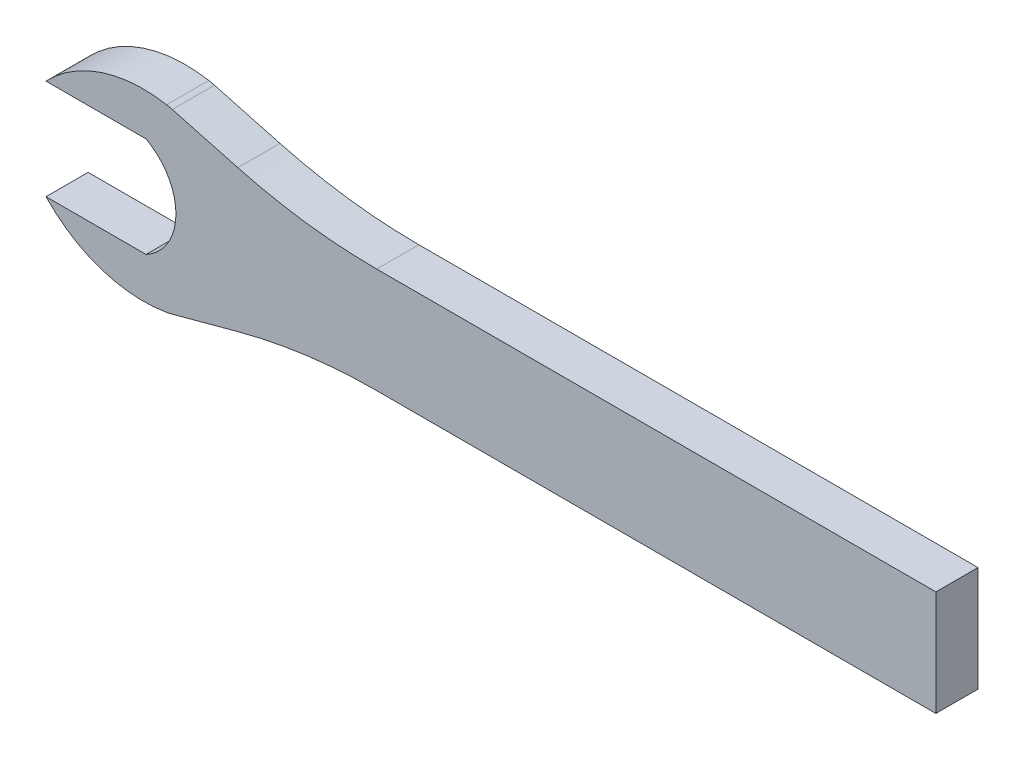
ISO-10303-21;
HEADER;
FILE_DESCRIPTION(('STEP AP214'),'2;1');
FILE_NAME('part.step','',(''),(''),'','','');
FILE_SCHEMA(('AUTOMOTIVE_DESIGN { 1 0 10303 214 1 1 1 1 }'));
ENDSEC;
DATA;
#1=APPLICATION_CONTEXT('core data for automotive mechanical design processes');
#2=APPLICATION_PROTOCOL_DEFINITION('international standard','automotive_design',2000,#1);
#3=PRODUCT_CONTEXT('',#1,'mechanical');
#4=PRODUCT('Part','Part','',(#3));
#5=PRODUCT_RELATED_PRODUCT_CATEGORY('part','',(#4));
#6=PRODUCT_DEFINITION_FORMATION('','',#4);
#7=PRODUCT_DEFINITION_CONTEXT('part definition',#1,'design');
#8=PRODUCT_DEFINITION('design','',#6,#7);
#9=PRODUCT_DEFINITION_SHAPE('','',#8);
#10=(LENGTH_UNIT() NAMED_UNIT(*) SI_UNIT(.MILLI.,.METRE.));
#11=(NAMED_UNIT(*) PLANE_ANGLE_UNIT() SI_UNIT($,.RADIAN.));
#12=(NAMED_UNIT(*) SI_UNIT($,.STERADIAN.) SOLID_ANGLE_UNIT());
#13=UNCERTAINTY_MEASURE_WITH_UNIT(LENGTH_MEASURE(1.E-05),#10,'distance_accuracy_value','');
#14=(GEOMETRIC_REPRESENTATION_CONTEXT(3) GLOBAL_UNCERTAINTY_ASSIGNED_CONTEXT((#13)) GLOBAL_UNIT_ASSIGNED_CONTEXT((#10,
#11,#12)) REPRESENTATION_CONTEXT('',''));
#15=CARTESIAN_POINT('',(0.,0.,0.));
#16=DIRECTION('',(0.,0.,1.));
#17=DIRECTION('',(1.,0.,0.));
#18=AXIS2_PLACEMENT_3D('',#15,#16,#17);
#19=CARTESIAN_POINT('',(1.69056275366741,4.56663578812574,-4.));
#20=DIRECTION('',(0.,0.,1.));
#21=DIRECTION('',(1.,0.,0.));
#22=AXIS2_PLACEMENT_3D('',#19,#20,#21);
#23=CYLINDRICAL_SURFACE('',#22,12.7);
#24=CARTESIAN_POINT('',(1.69056275366741,4.56663578812574,4.));
#25=DIRECTION('',(0.,0.,1.));
#26=DIRECTION('',(1.,0.,0.));
#27=AXIS2_PLACEMENT_3D('',#24,#25,#26);
#28=CIRCLE('',#27,12.7);
#29=CARTESIAN_POINT('',(4.98881020496705,16.8308750123905,4.));
#30=VERTEX_POINT('',#29);
#31=CARTESIAN_POINT('',(3.91240617571897,17.0707715762515,4.));
#32=VERTEX_POINT('',#31);
#33=EDGE_CURVE('E235',#30,#32,#28,.T.);
#34=ORIENTED_EDGE('',*,*,#33,.F.);
#35=DIRECTION('',(0.,0.,1.));
#36=VECTOR('',#35,1.);
#37=CARTESIAN_POINT('',(4.98881020496704,16.8308750123905,-4.));
#38=LINE('',#37,#36);
#39=CARTESIAN_POINT('',(4.98881020496705,16.8308750123905,-4.));
#40=VERTEX_POINT('',#39);
#41=EDGE_CURVE('E67',#40,#30,#38,.T.);
#42=ORIENTED_EDGE('',*,*,#41,.F.);
#43=CARTESIAN_POINT('',(1.69056275366741,4.56663578812574,-4.));
#44=DIRECTION('',(0.,0.,1.));
#45=DIRECTION('',(1.,0.,0.));
#46=AXIS2_PLACEMENT_3D('',#43,#44,#45);
#47=CIRCLE('',#46,12.7);
#48=CARTESIAN_POINT('',(3.91240617571897,17.0707715762515,-4.));
#49=VERTEX_POINT('',#48);
#50=EDGE_CURVE('E218',#40,#49,#47,.T.);
#51=ORIENTED_EDGE('',*,*,#50,.T.);
#52=DIRECTION('',(0.,0.,1.));
#53=VECTOR('',#52,1.);
#54=CARTESIAN_POINT('',(3.91240617571897,17.0707715762515,-4.));
#55=LINE('',#54,#53);
#56=EDGE_CURVE('E248',#49,#32,#55,.T.);
#57=ORIENTED_EDGE('',*,*,#56,.T.);
#58=EDGE_LOOP('',(#34,#42,#51,#57));
#59=FACE_BOUND('',#58,.T.);
#60=ADVANCED_FACE('F42',(#59),#23,.T.);
#61=CARTESIAN_POINT('',(0.,-9.5,-4.));
#62=DIRECTION('',(0.,-1.,0.));
#63=DIRECTION('',(1.,0.,0.));
#64=AXIS2_PLACEMENT_3D('',#61,#62,#63);
#65=PLANE('',#64);
#66=DIRECTION('',(1.,0.,0.));
#67=VECTOR('',#66,1.);
#68=CARTESIAN_POINT('',(0.,-9.5,4.));
#69=LINE('',#68,#67);
#70=CARTESIAN_POINT('',(-19.,-9.5,4.));
#71=VERTEX_POINT('',#70);
#72=CARTESIAN_POINT('',(0.,-9.5,4.));
#73=VERTEX_POINT('',#72);
#74=EDGE_CURVE('E199',#71,#73,#69,.T.);
#75=ORIENTED_EDGE('',*,*,#74,.T.);
#76=DIRECTION('',(0.,0.,1.));
#77=VECTOR('',#76,1.);
#78=CARTESIAN_POINT('',(0.,-9.5,-4.));
#79=LINE('',#78,#77);
#80=CARTESIAN_POINT('',(0.,-9.5,-4.));
#81=VERTEX_POINT('',#80);
#82=EDGE_CURVE('E11',#81,#73,#79,.T.);
#83=ORIENTED_EDGE('',*,*,#82,.F.);
#84=DIRECTION('',(1.,0.,0.));
#85=VECTOR('',#84,1.);
#86=CARTESIAN_POINT('',(0.,-9.5,-4.));
#87=LINE('',#86,#85);
#88=CARTESIAN_POINT('',(-19.,-9.5,-4.));
#89=VERTEX_POINT('',#88);
#90=EDGE_CURVE('E211',#89,#81,#87,.T.);
#91=ORIENTED_EDGE('',*,*,#90,.F.);
#92=DIRECTION('',(0.,0.,1.));
#93=VECTOR('',#92,1.);
#94=CARTESIAN_POINT('',(-19.,-9.5,-4.));
#95=LINE('',#94,#93);
#96=EDGE_CURVE('E46',#89,#71,#95,.T.);
#97=ORIENTED_EDGE('',*,*,#96,.T.);
#98=EDGE_LOOP('',(#75,#83,#91,#97));
#99=FACE_BOUND('',#98,.T.);
#100=ADVANCED_FACE('F44',(#99),#65,.F.);
#101=CARTESIAN_POINT('',(-5.11100762962849,0.,-4.));
#102=DIRECTION('',(0.,0.,1.));
#103=DIRECTION('',(1.,0.,0.));
#104=AXIS2_PLACEMENT_3D('',#101,#102,#103);
#105=CYLINDRICAL_SURFACE('',#104,10.7876039503738);
#106=CARTESIAN_POINT('',(-5.11100762962849,0.,4.));
#107=DIRECTION('',(0.,0.,1.));
#108=DIRECTION('',(1.,0.,0.));
#109=AXIS2_PLACEMENT_3D('',#106,#107,#108);
#110=CIRCLE('',#109,10.7876039503738);
#111=CARTESIAN_POINT('',(0.,9.5,4.));
#112=VERTEX_POINT('',#111);
#113=EDGE_CURVE('E214',#112,#73,#110,.F.);
#114=ORIENTED_EDGE('',*,*,#113,.F.);
#115=DIRECTION('',(0.,0.,1.));
#116=VECTOR('',#115,1.);
#117=CARTESIAN_POINT('',(0.,9.5,-4.));
#118=LINE('',#117,#116);
#119=CARTESIAN_POINT('',(0.,9.5,-4.));
#120=VERTEX_POINT('',#119);
#121=EDGE_CURVE('E51',#120,#112,#118,.T.);
#122=ORIENTED_EDGE('',*,*,#121,.F.);
#123=CARTESIAN_POINT('',(-5.11100762962849,0.,-4.));
#124=DIRECTION('',(0.,0.,1.));
#125=DIRECTION('',(1.,0.,0.));
#126=AXIS2_PLACEMENT_3D('',#123,#124,#125);
#127=CIRCLE('',#126,10.7876039503738);
#128=EDGE_CURVE('E225',#120,#81,#127,.F.);
#129=ORIENTED_EDGE('',*,*,#128,.T.);
#130=ORIENTED_EDGE('',*,*,#82,.T.);
#131=EDGE_LOOP('',(#114,#122,#129,#130));
#132=FACE_BOUND('',#131,.T.);
#133=ADVANCED_FACE('F279',(#132),#105,.F.);
#134=CARTESIAN_POINT('',(0.,9.5,-4.));
#135=DIRECTION('',(0.,1.,0.));
#136=DIRECTION('',(0.,0.,1.));
#137=AXIS2_PLACEMENT_3D('',#134,#135,#136);
#138=PLANE('',#137);
#139=DIRECTION('',(-1.,0.,0.));
#140=VECTOR('',#139,1.);
#141=CARTESIAN_POINT('',(0.,9.5,4.));
#142=LINE('',#141,#140);
#143=CARTESIAN_POINT('',(-19.,9.5,4.));
#144=VERTEX_POINT('',#143);
#145=EDGE_CURVE('E240',#112,#144,#142,.T.);
#146=ORIENTED_EDGE('',*,*,#145,.T.);
#147=DIRECTION('',(0.,0.,1.));
#148=VECTOR('',#147,1.);
#149=CARTESIAN_POINT('',(-19.,9.5,-4.));
#150=LINE('',#149,#148);
#151=CARTESIAN_POINT('',(-19.,9.5,-4.));
#152=VERTEX_POINT('',#151);
#153=EDGE_CURVE('E246',#152,#144,#150,.T.);
#154=ORIENTED_EDGE('',*,*,#153,.F.);
#155=DIRECTION('',(-1.,0.,0.));
#156=VECTOR('',#155,1.);
#157=CARTESIAN_POINT('',(0.,9.5,-4.));
#158=LINE('',#157,#156);
#159=EDGE_CURVE('E223',#120,#152,#158,.T.);
#160=ORIENTED_EDGE('',*,*,#159,.F.);
#161=ORIENTED_EDGE('',*,*,#121,.T.);
#162=EDGE_LOOP('',(#146,#154,#160,#161));
#163=FACE_BOUND('',#162,.T.);
#164=ADVANCED_FACE('F282',(#163),#138,.F.);
#165=CARTESIAN_POINT('',(-0.531280668383816,-7.93750000000095,-4.));
#166=DIRECTION('',(0.,0.,1.));
#167=DIRECTION('',(1.,0.,0.));
#168=AXIS2_PLACEMENT_3D('',#165,#166,#167);
#169=CYLINDRICAL_SURFACE('',#168,25.4000000000009);
#170=CARTESIAN_POINT('',(-0.531280668383816,-7.93750000000095,4.));
#171=DIRECTION('',(0.,0.,1.));
#172=DIRECTION('',(1.,0.,0.));
#173=AXIS2_PLACEMENT_3D('',#170,#171,#172);
#174=CIRCLE('',#173,25.4000000000009);
#175=EDGE_CURVE('E237',#32,#144,#174,.T.);
#176=ORIENTED_EDGE('',*,*,#175,.F.);
#177=ORIENTED_EDGE('',*,*,#56,.F.);
#178=CARTESIAN_POINT('',(-0.531280668383816,-7.93750000000095,-4.));
#179=DIRECTION('',(0.,0.,1.));
#180=DIRECTION('',(1.,0.,0.));
#181=AXIS2_PLACEMENT_3D('',#178,#179,#180);
#182=CIRCLE('',#181,25.4000000000009);
#183=EDGE_CURVE('E220',#49,#152,#182,.T.);
#184=ORIENTED_EDGE('',*,*,#183,.T.);
#185=ORIENTED_EDGE('',*,*,#153,.T.);
#186=EDGE_LOOP('',(#176,#177,#184,#185));
#187=FACE_BOUND('',#186,.T.);
#188=ADVANCED_FACE('F273',(#187),#169,.T.);
#189=CARTESIAN_POINT('',(1.69056275366741,-4.56663578812575,-4.));
#190=DIRECTION('',(0.,0.,1.));
#191=DIRECTION('',(1.,0.,0.));
#192=AXIS2_PLACEMENT_3D('',#189,#190,#191);
#193=CYLINDRICAL_SURFACE('',#192,12.7);
#194=CARTESIAN_POINT('',(1.69056275366741,-4.56663578812575,-4.));
#195=DIRECTION('',(0.,0.,1.));
#196=DIRECTION('',(1.,0.,0.));
#197=AXIS2_PLACEMENT_3D('',#194,#195,#196);
#198=CIRCLE('',#197,12.7);
#199=CARTESIAN_POINT('',(4.98881020496704,-16.8308750123905,-4.));
#200=VERTEX_POINT('',#199);
#201=CARTESIAN_POINT('',(3.91240617571898,-17.0707715762514,-4.));
#202=VERTEX_POINT('',#201);
#203=EDGE_CURVE('E59',#200,#202,#198,.F.);
#204=ORIENTED_EDGE('',*,*,#203,.F.);
#205=DIRECTION('',(0.,0.,1.));
#206=VECTOR('',#205,1.);
#207=CARTESIAN_POINT('',(4.98881020496704,-16.8308750123905,-4.));
#208=LINE('',#207,#206);
#209=CARTESIAN_POINT('',(4.98881020496704,-16.8308750123905,4.));
#210=VERTEX_POINT('',#209);
#211=EDGE_CURVE('E156',#200,#210,#208,.T.);
#212=ORIENTED_EDGE('',*,*,#211,.T.);
#213=CARTESIAN_POINT('',(1.69056275366741,-4.56663578812575,4.));
#214=DIRECTION('',(0.,0.,1.));
#215=DIRECTION('',(1.,0.,0.));
#216=AXIS2_PLACEMENT_3D('',#213,#214,#215);
#217=CIRCLE('',#216,12.7);
#218=CARTESIAN_POINT('',(3.91240617571898,-17.0707715762514,4.));
#219=VERTEX_POINT('',#218);
#220=EDGE_CURVE('E233',#210,#219,#217,.F.);
#221=ORIENTED_EDGE('',*,*,#220,.T.);
#222=DIRECTION('',(0.,0.,1.));
#223=VECTOR('',#222,1.);
#224=CARTESIAN_POINT('',(3.91240617571898,-17.0707715762514,-4.));
#225=LINE('',#224,#223);
#226=EDGE_CURVE('E250',#202,#219,#225,.T.);
#227=ORIENTED_EDGE('',*,*,#226,.F.);
#228=EDGE_LOOP('',(#204,#212,#221,#227));
#229=FACE_BOUND('',#228,.T.);
#230=ADVANCED_FACE('F265',(#229),#193,.T.);
#231=CARTESIAN_POINT('',(-0.531280668384144,7.93749999999996,-4.));
#232=DIRECTION('',(0.,0.,1.));
#233=DIRECTION('',(1.,0.,0.));
#234=AXIS2_PLACEMENT_3D('',#231,#232,#233);
#235=CYLINDRICAL_SURFACE('',#234,25.4);
#236=CARTESIAN_POINT('',(-0.531280668384144,7.93749999999996,4.));
#237=DIRECTION('',(0.,0.,1.));
#238=DIRECTION('',(1.,0.,0.));
#239=AXIS2_PLACEMENT_3D('',#236,#237,#238);
#240=CIRCLE('',#239,25.4);
#241=EDGE_CURVE('E230',#71,#219,#240,.T.);
#242=ORIENTED_EDGE('',*,*,#241,.F.);
#243=ORIENTED_EDGE('',*,*,#96,.F.);
#244=CARTESIAN_POINT('',(-0.531280668384144,7.93749999999996,-4.));
#245=DIRECTION('',(0.,0.,1.));
#246=DIRECTION('',(1.,0.,0.));
#247=AXIS2_PLACEMENT_3D('',#244,#245,#246);
#248=CIRCLE('',#247,25.4);
#249=EDGE_CURVE('E213',#89,#202,#248,.T.);
#250=ORIENTED_EDGE('',*,*,#249,.T.);
#251=ORIENTED_EDGE('',*,*,#226,.T.);
#252=EDGE_LOOP('',(#242,#243,#250,#251));
#253=FACE_BOUND('',#252,.T.);
#254=ADVANCED_FACE('F263',(#253),#235,.T.);
#255=CARTESIAN_POINT('',(0.,0.,-4.));
#256=DIRECTION('',(0.,0.,1.));
#257=DIRECTION('',(1.,0.,0.));
#258=AXIS2_PLACEMENT_3D('',#255,#256,#257);
#259=PLANE('',#258);
#260=ORIENTED_EDGE('',*,*,#50,.F.);
#261=DIRECTION('',(-0.965688127894867,0.259704523724381,0.));
#262=VECTOR('',#261,1.);
#263=CARTESIAN_POINT('',(4.55755280652134,16.9468539646327,-4.));
#264=LINE('',#263,#262);
#265=CARTESIAN_POINT('',(17.4261093110442,13.4860862058815,-4.));
#266=VERTEX_POINT('',#265);
#267=EDGE_CURVE('E179',#266,#40,#264,.T.);
#268=ORIENTED_EDGE('',*,*,#267,.F.);
#269=CARTESIAN_POINT('',(43.8120889214412,111.6,-4.));
#270=DIRECTION('',(0.,0.,1.));
#271=DIRECTION('',(1.,0.,0.));
#272=AXIS2_PLACEMENT_3D('',#269,#270,#271);
#273=CIRCLE('',#272,101.6);
#274=CARTESIAN_POINT('',(43.8120889214412,9.99999999999999,-4.));
#275=VERTEX_POINT('',#274);
#276=EDGE_CURVE('E177',#266,#275,#273,.T.);
#277=ORIENTED_EDGE('',*,*,#276,.T.);
#278=DIRECTION('',(1.,0.,0.));
#279=VECTOR('',#278,1.);
#280=CARTESIAN_POINT('',(0.,9.99999999999999,-4.));
#281=LINE('',#280,#279);
#282=CARTESIAN_POINT('',(150.,9.99999999999999,-4.));
#283=VERTEX_POINT('',#282);
#284=EDGE_CURVE('E175',#275,#283,#281,.T.);
#285=ORIENTED_EDGE('',*,*,#284,.T.);
#286=DIRECTION('',(0.,1.,0.));
#287=VECTOR('',#286,1.);
#288=CARTESIAN_POINT('',(150.,0.,-4.));
#289=LINE('',#288,#287);
#290=CARTESIAN_POINT('',(150.,-9.99999999999999,-4.));
#291=VERTEX_POINT('',#290);
#292=EDGE_CURVE('E170',#291,#283,#289,.T.);
#293=ORIENTED_EDGE('',*,*,#292,.F.);
#294=DIRECTION('',(1.,0.,0.));
#295=VECTOR('',#294,1.);
#296=CARTESIAN_POINT('',(0.,-9.99999999999999,-4.));
#297=LINE('',#296,#295);
#298=CARTESIAN_POINT('',(43.8120889214412,-9.99999999999999,-4.));
#299=VERTEX_POINT('',#298);
#300=EDGE_CURVE('E168',#299,#291,#297,.T.);
#301=ORIENTED_EDGE('',*,*,#300,.F.);
#302=CARTESIAN_POINT('',(43.8120889214412,-111.6,-4.));
#303=DIRECTION('',(0.,0.,1.));
#304=DIRECTION('',(1.,0.,0.));
#305=AXIS2_PLACEMENT_3D('',#302,#303,#304);
#306=CIRCLE('',#305,101.6);
#307=CARTESIAN_POINT('',(17.4261093110442,-13.4860862058815,-4.));
#308=VERTEX_POINT('',#307);
#309=EDGE_CURVE('E149',#308,#299,#306,.F.);
#310=ORIENTED_EDGE('',*,*,#309,.F.);
#311=DIRECTION('',(-0.965688127894867,-0.259704523724381,0.));
#312=VECTOR('',#311,1.);
#313=CARTESIAN_POINT('',(4.55755280652132,-16.9468539646327,-4.));
#314=LINE('',#313,#312);
#315=EDGE_CURVE('E159',#308,#200,#314,.T.);
#316=ORIENTED_EDGE('',*,*,#315,.T.);
#317=ORIENTED_EDGE('',*,*,#203,.T.);
#318=ORIENTED_EDGE('',*,*,#249,.F.);
#319=ORIENTED_EDGE('',*,*,#90,.T.);
#320=ORIENTED_EDGE('',*,*,#128,.F.);
#321=ORIENTED_EDGE('',*,*,#159,.T.);
#322=ORIENTED_EDGE('',*,*,#183,.F.);
#323=EDGE_LOOP('',(#260,#268,#277,#285,#293,#301,#310,#316,#317,#318,#319,#320,#321,#322));
#324=FACE_BOUND('',#323,.T.);
#325=ADVANCED_FACE('F165',(#324),#259,.F.);
#326=CARTESIAN_POINT('',(0.,0.,4.));
#327=DIRECTION('',(0.,0.,1.));
#328=DIRECTION('',(1.,0.,0.));
#329=AXIS2_PLACEMENT_3D('',#326,#327,#328);
#330=PLANE('',#329);
#331=DIRECTION('',(-0.965688127894867,0.259704523724381,0.));
#332=VECTOR('',#331,1.);
#333=CARTESIAN_POINT('',(4.55755280652134,16.9468539646327,4.));
#334=LINE('',#333,#332);
#335=CARTESIAN_POINT('',(17.4261093110442,13.4860862058815,4.));
#336=VERTEX_POINT('',#335);
#337=EDGE_CURVE('E162',#336,#30,#334,.T.);
#338=ORIENTED_EDGE('',*,*,#337,.T.);
#339=ORIENTED_EDGE('',*,*,#33,.T.);
#340=ORIENTED_EDGE('',*,*,#175,.T.);
#341=ORIENTED_EDGE('',*,*,#145,.F.);
#342=ORIENTED_EDGE('',*,*,#113,.T.);
#343=ORIENTED_EDGE('',*,*,#74,.F.);
#344=ORIENTED_EDGE('',*,*,#241,.T.);
#345=ORIENTED_EDGE('',*,*,#220,.F.);
#346=DIRECTION('',(-0.965688127894867,-0.259704523724381,0.));
#347=VECTOR('',#346,1.);
#348=CARTESIAN_POINT('',(4.55755280652132,-16.9468539646327,4.));
#349=LINE('',#348,#347);
#350=CARTESIAN_POINT('',(17.4261093110442,-13.4860862058815,4.));
#351=VERTEX_POINT('',#350);
#352=EDGE_CURVE('E182',#351,#210,#349,.T.);
#353=ORIENTED_EDGE('',*,*,#352,.F.);
#354=CARTESIAN_POINT('',(43.8120889214412,-111.6,4.));
#355=DIRECTION('',(0.,0.,1.));
#356=DIRECTION('',(1.,0.,0.));
#357=AXIS2_PLACEMENT_3D('',#354,#355,#356);
#358=CIRCLE('',#357,101.6);
#359=CARTESIAN_POINT('',(43.8120889214412,-9.99999999999999,4.));
#360=VERTEX_POINT('',#359);
#361=EDGE_CURVE('E151',#351,#360,#358,.F.);
#362=ORIENTED_EDGE('',*,*,#361,.T.);
#363=DIRECTION('',(1.,0.,0.));
#364=VECTOR('',#363,1.);
#365=CARTESIAN_POINT('',(0.,-9.99999999999999,4.));
#366=LINE('',#365,#364);
#367=CARTESIAN_POINT('',(150.,-9.99999999999999,4.));
#368=VERTEX_POINT('',#367);
#369=EDGE_CURVE('E185',#360,#368,#366,.T.);
#370=ORIENTED_EDGE('',*,*,#369,.T.);
#371=DIRECTION('',(0.,1.,0.));
#372=VECTOR('',#371,1.);
#373=CARTESIAN_POINT('',(150.,0.,4.));
#374=LINE('',#373,#372);
#375=CARTESIAN_POINT('',(150.,9.99999999999999,4.));
#376=VERTEX_POINT('',#375);
#377=EDGE_CURVE('E188',#368,#376,#374,.T.);
#378=ORIENTED_EDGE('',*,*,#377,.T.);
#379=DIRECTION('',(1.,0.,0.));
#380=VECTOR('',#379,1.);
#381=CARTESIAN_POINT('',(0.,9.99999999999999,4.));
#382=LINE('',#381,#380);
#383=CARTESIAN_POINT('',(43.8120889214412,9.99999999999999,4.));
#384=VERTEX_POINT('',#383);
#385=EDGE_CURVE('E191',#384,#376,#382,.T.);
#386=ORIENTED_EDGE('',*,*,#385,.F.);
#387=CARTESIAN_POINT('',(43.8120889214412,111.6,4.));
#388=DIRECTION('',(0.,0.,1.));
#389=DIRECTION('',(1.,0.,0.));
#390=AXIS2_PLACEMENT_3D('',#387,#388,#389);
#391=CIRCLE('',#390,101.6);
#392=EDGE_CURVE('E194',#336,#384,#391,.T.);
#393=ORIENTED_EDGE('',*,*,#392,.F.);
#394=EDGE_LOOP('',(#338,#339,#340,#341,#342,#343,#344,#345,#353,#362,#370,#378,#386,#393));
#395=FACE_BOUND('',#394,.T.);
#396=ADVANCED_FACE('F260',(#395),#330,.T.);
#397=CARTESIAN_POINT('',(4.55755280652134,16.9468539646327,-4.));
#398=DIRECTION('',(0.259704523724381,0.965688127894867,0.));
#399=DIRECTION('',(-0.965688127894867,0.259704523724381,0.));
#400=AXIS2_PLACEMENT_3D('',#397,#398,#399);
#401=PLANE('',#400);
#402=ORIENTED_EDGE('',*,*,#337,.F.);
#403=DIRECTION('',(0.,0.,1.));
#404=VECTOR('',#403,1.);
#405=CARTESIAN_POINT('',(17.4261093110442,13.4860862058815,-4.));
#406=LINE('',#405,#404);
#407=EDGE_CURVE('E200',#266,#336,#406,.T.);
#408=ORIENTED_EDGE('',*,*,#407,.F.);
#409=ORIENTED_EDGE('',*,*,#267,.T.);
#410=ORIENTED_EDGE('',*,*,#41,.T.);
#411=EDGE_LOOP('',(#402,#408,#409,#410));
#412=FACE_BOUND('',#411,.T.);
#413=ADVANCED_FACE('F291',(#412),#401,.T.);
#414=CARTESIAN_POINT('',(43.8120889214412,111.6,-4.));
#415=DIRECTION('',(0.,0.,1.));
#416=DIRECTION('',(1.,0.,0.));
#417=AXIS2_PLACEMENT_3D('',#414,#415,#416);
#418=CYLINDRICAL_SURFACE('',#417,101.6);
#419=ORIENTED_EDGE('',*,*,#392,.T.);
#420=DIRECTION('',(0.,0.,1.));
#421=VECTOR('',#420,1.);
#422=CARTESIAN_POINT('',(43.8120889214412,9.99999999999999,-4.));
#423=LINE('',#422,#421);
#424=EDGE_CURVE('E202',#275,#384,#423,.T.);
#425=ORIENTED_EDGE('',*,*,#424,.F.);
#426=ORIENTED_EDGE('',*,*,#276,.F.);
#427=ORIENTED_EDGE('',*,*,#407,.T.);
#428=EDGE_LOOP('',(#419,#425,#426,#427));
#429=FACE_BOUND('',#428,.T.);
#430=ADVANCED_FACE('F308',(#429),#418,.F.);
#431=CARTESIAN_POINT('',(0.,9.99999999999999,-4.));
#432=DIRECTION('',(0.,-1.,0.));
#433=DIRECTION('',(0.,0.,-1.));
#434=AXIS2_PLACEMENT_3D('',#431,#432,#433);
#435=PLANE('',#434);
#436=ORIENTED_EDGE('',*,*,#385,.T.);
#437=DIRECTION('',(0.,0.,1.));
#438=VECTOR('',#437,1.);
#439=CARTESIAN_POINT('',(150.,9.99999999999999,-4.));
#440=LINE('',#439,#438);
#441=EDGE_CURVE('E205',#283,#376,#440,.T.);
#442=ORIENTED_EDGE('',*,*,#441,.F.);
#443=ORIENTED_EDGE('',*,*,#284,.F.);
#444=ORIENTED_EDGE('',*,*,#424,.T.);
#445=EDGE_LOOP('',(#436,#442,#443,#444));
#446=FACE_BOUND('',#445,.T.);
#447=ADVANCED_FACE('F304',(#446),#435,.F.);
#448=CARTESIAN_POINT('',(150.,0.,-4.));
#449=DIRECTION('',(1.,0.,0.));
#450=DIRECTION('',(0.,0.,-1.));
#451=AXIS2_PLACEMENT_3D('',#448,#449,#450);
#452=PLANE('',#451);
#453=ORIENTED_EDGE('',*,*,#377,.F.);
#454=DIRECTION('',(0.,0.,1.));
#455=VECTOR('',#454,1.);
#456=CARTESIAN_POINT('',(150.,-9.99999999999999,-4.));
#457=LINE('',#456,#455);
#458=EDGE_CURVE('E207',#291,#368,#457,.T.);
#459=ORIENTED_EDGE('',*,*,#458,.F.);
#460=ORIENTED_EDGE('',*,*,#292,.T.);
#461=ORIENTED_EDGE('',*,*,#441,.T.);
#462=EDGE_LOOP('',(#453,#459,#460,#461));
#463=FACE_BOUND('',#462,.T.);
#464=ADVANCED_FACE('F300',(#463),#452,.T.);
#465=CARTESIAN_POINT('',(0.,-9.99999999999999,-4.));
#466=DIRECTION('',(0.,-1.,0.));
#467=DIRECTION('',(0.,0.,-1.));
#468=AXIS2_PLACEMENT_3D('',#465,#466,#467);
#469=PLANE('',#468);
#470=ORIENTED_EDGE('',*,*,#369,.F.);
#471=DIRECTION('',(0.,0.,1.));
#472=VECTOR('',#471,1.);
#473=CARTESIAN_POINT('',(43.8120889214412,-9.99999999999999,-4.));
#474=LINE('',#473,#472);
#475=EDGE_CURVE('E155',#299,#360,#474,.T.);
#476=ORIENTED_EDGE('',*,*,#475,.F.);
#477=ORIENTED_EDGE('',*,*,#300,.T.);
#478=ORIENTED_EDGE('',*,*,#458,.T.);
#479=EDGE_LOOP('',(#470,#476,#477,#478));
#480=FACE_BOUND('',#479,.T.);
#481=ADVANCED_FACE('F297',(#480),#469,.T.);
#482=CARTESIAN_POINT('',(43.8120889214412,-111.6,-4.));
#483=DIRECTION('',(0.,0.,1.));
#484=DIRECTION('',(1.,0.,0.));
#485=AXIS2_PLACEMENT_3D('',#482,#483,#484);
#486=CYLINDRICAL_SURFACE('',#485,101.6);
#487=ORIENTED_EDGE('',*,*,#361,.F.);
#488=DIRECTION('',(0.,0.,1.));
#489=VECTOR('',#488,1.);
#490=CARTESIAN_POINT('',(17.4261093110442,-13.4860862058815,-4.));
#491=LINE('',#490,#489);
#492=EDGE_CURVE('E145',#308,#351,#491,.T.);
#493=ORIENTED_EDGE('',*,*,#492,.F.);
#494=ORIENTED_EDGE('',*,*,#309,.T.);
#495=ORIENTED_EDGE('',*,*,#475,.T.);
#496=EDGE_LOOP('',(#487,#493,#494,#495));
#497=FACE_BOUND('',#496,.T.);
#498=ADVANCED_FACE('F147',(#497),#486,.F.);
#499=CARTESIAN_POINT('',(4.55755280652132,-16.9468539646327,-4.));
#500=DIRECTION('',(-0.259704523724381,0.965688127894867,0.));
#501=DIRECTION('',(-0.965688127894867,-0.259704523724381,0.));
#502=AXIS2_PLACEMENT_3D('',#499,#500,#501);
#503=PLANE('',#502);
#504=ORIENTED_EDGE('',*,*,#352,.T.);
#505=ORIENTED_EDGE('',*,*,#211,.F.);
#506=ORIENTED_EDGE('',*,*,#315,.F.);
#507=ORIENTED_EDGE('',*,*,#492,.T.);
#508=EDGE_LOOP('',(#504,#505,#506,#507));
#509=FACE_BOUND('',#508,.T.);
#510=ADVANCED_FACE('F160',(#509),#503,.F.);
#511=CLOSED_SHELL('',(#60,#100,#133,#164,#188,#230,#254,#325,#396,#413,#430,#447,#464,#481,#498,#510));
#512=MANIFOLD_SOLID_BREP('B2',#511);
#513=ADVANCED_BREP_SHAPE_REPRESENTATION('',(#18,#512),#14);
#514=SHAPE_DEFINITION_REPRESENTATION(#9,#513);
ENDSEC;
END-ISO-10303-21;
